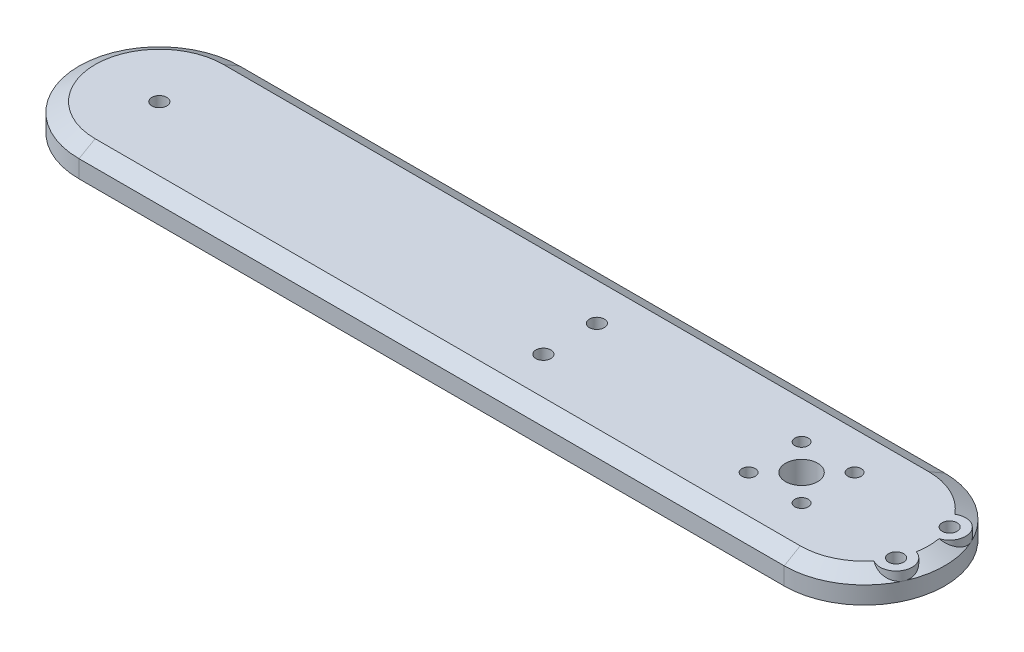
ISO-10303-21;
HEADER;
FILE_DESCRIPTION(('STEP AP214'),'2;1');
FILE_NAME('part.step','',(''),(''),'','','');
FILE_SCHEMA(('AUTOMOTIVE_DESIGN { 1 0 10303 214 1 1 1 1 }'));
ENDSEC;
DATA;
#1=APPLICATION_CONTEXT('core data for automotive mechanical design processes');
#2=APPLICATION_PROTOCOL_DEFINITION('international standard','automotive_design',2000,#1);
#3=PRODUCT_CONTEXT('',#1,'mechanical');
#4=PRODUCT('Part','Part','',(#3));
#5=PRODUCT_RELATED_PRODUCT_CATEGORY('part','',(#4));
#6=PRODUCT_DEFINITION_FORMATION('','',#4);
#7=PRODUCT_DEFINITION_CONTEXT('part definition',#1,'design');
#8=PRODUCT_DEFINITION('design','',#6,#7);
#9=PRODUCT_DEFINITION_SHAPE('','',#8);
#10=(LENGTH_UNIT() NAMED_UNIT(*) SI_UNIT(.MILLI.,.METRE.));
#11=(NAMED_UNIT(*) PLANE_ANGLE_UNIT() SI_UNIT($,.RADIAN.));
#12=(NAMED_UNIT(*) SI_UNIT($,.STERADIAN.) SOLID_ANGLE_UNIT());
#13=UNCERTAINTY_MEASURE_WITH_UNIT(LENGTH_MEASURE(1.E-05),#10,'distance_accuracy_value','');
#14=(GEOMETRIC_REPRESENTATION_CONTEXT(3) GLOBAL_UNCERTAINTY_ASSIGNED_CONTEXT((#13)) GLOBAL_UNIT_ASSIGNED_CONTEXT((#10,
#11,#12)) REPRESENTATION_CONTEXT('',''));
#15=CARTESIAN_POINT('',(0.,0.,0.));
#16=DIRECTION('',(0.,0.,1.));
#17=DIRECTION('',(1.,0.,0.));
#18=AXIS2_PLACEMENT_3D('',#15,#16,#17);
#19=CARTESIAN_POINT('',(131.75,5.,0.));
#20=DIRECTION('',(0.,-1.,0.));
#21=DIRECTION('',(0.,0.,-1.));
#22=AXIS2_PLACEMENT_3D('',#19,#20,#21);
#23=CONICAL_SURFACE('',#22,12.,1.0471975511966);
#24=CARTESIAN_POINT('',(131.75,5.,0.));
#25=DIRECTION('',(0.,1.,0.));
#26=DIRECTION('',(0.,0.,1.));
#27=AXIS2_PLACEMENT_3D('',#24,#25,#26);
#28=CIRCLE('',#27,12.);
#29=CARTESIAN_POINT('',(141.077618933992,5.,-7.54953806681159));
#30=VERTEX_POINT('',#29);
#31=CARTESIAN_POINT('',(131.75,5.,-12.));
#32=VERTEX_POINT('',#31);
#33=EDGE_CURVE('E144',#30,#32,#28,.T.);
#34=ORIENTED_EDGE('',*,*,#33,.F.);
#35=CARTESIAN_POINT('',(141.077322224237,5.0002,-7.54935403868238));
#36=CARTESIAN_POINT('',(141.156557252533,4.94678817044797,-7.59849532245087));
#37=CARTESIAN_POINT('',(141.238157752973,4.89363214228214,-7.64400414252746));
#38=CARTESIAN_POINT('',(141.405675913293,4.78807578622649,-7.72739358204015));
#39=CARTESIAN_POINT('',(141.491595007884,4.73567571701977,-7.76527164519904));
#40=CARTESIAN_POINT('',(141.755674700648,4.57970582150423,-7.86707972239534));
#41=CARTESIAN_POINT('',(141.939658060023,4.47770274482218,-7.9188722322073));
#42=CARTESIAN_POINT('',(142.318130790524,4.28039509828638,-7.98681766693718));
#43=CARTESIAN_POINT('',(142.512644761588,4.18510752549572,-8.00288309639194));
#44=CARTESIAN_POINT('',(142.905273479851,4.00426126042279,-7.99627527436065));
#45=CARTESIAN_POINT('',(143.103381423363,3.91868603955574,-7.97366892195534));
#46=CARTESIAN_POINT('',(143.479570242659,3.76653113962029,-7.89137434460179));
#47=CARTESIAN_POINT('',(143.657943074556,3.69896232923984,-7.83493708454001));
#48=CARTESIAN_POINT('',(143.917769278529,3.60717328589838,-7.72464089293876));
#49=CARTESIAN_POINT('',(144.003120344002,3.57816170009228,-7.68358149180941));
#50=CARTESIAN_POINT('',(144.170380115844,3.52357315458263,-7.593048925895));
#51=CARTESIAN_POINT('',(144.252289255344,3.49799576182667,-7.54357682373976));
#52=CARTESIAN_POINT('',(144.473365142052,3.43219915627915,-7.39498703090635));
#53=CARTESIAN_POINT('',(144.607925303175,3.39591763412093,-7.28702479306738));
#54=CARTESIAN_POINT('',(144.857786247804,3.33634694159049,-7.04791607168051));
#55=CARTESIAN_POINT('',(144.973101256229,3.31304814506793,-6.91678686074889));
#56=CARTESIAN_POINT('',(145.17061181912,3.28175697218575,-6.64792576225177));
#57=CARTESIAN_POINT('',(145.254843331859,3.27258533345847,-6.51182432536301));
#58=CARTESIAN_POINT('',(145.400634043372,3.26604279846284,-6.22773560641844));
#59=CARTESIAN_POINT('',(145.46219944674,3.26866867015588,-6.07975159061647));
#60=CARTESIAN_POINT('',(145.558959984953,3.28529330605756,-5.78235505494448));
#61=CARTESIAN_POINT('',(145.595078374449,3.29885072054545,-5.63321644011285));
#62=CARTESIAN_POINT('',(145.64412187416,3.33635060085029,-5.33247956634609));
#63=CARTESIAN_POINT('',(145.657047018265,3.36029305149308,-5.18088131100518));
#64=CARTESIAN_POINT('',(145.660100556809,3.41834505023927,-4.87679354111265));
#65=CARTESIAN_POINT('',(145.649840452357,3.45261939971543,-4.72433217892598));
#66=CARTESIAN_POINT('',(145.606972106302,3.53023187094797,-4.42498204919223));
#67=CARTESIAN_POINT('',(145.574357809823,3.57357244618014,-4.27809480283431));
#68=CARTESIAN_POINT('',(145.485912140682,3.67126155153085,-3.98414475732932));
#69=CARTESIAN_POINT('',(145.428740320811,3.72613365451266,-3.83766084394096));
#70=CARTESIAN_POINT('',(145.293933076532,3.84359357328929,-3.55786580455139));
#71=CARTESIAN_POINT('',(145.216294424116,3.9061826053613,-3.4245567610423));
#72=CARTESIAN_POINT('',(145.03531961341,4.04396825769636,-3.16165162296553));
#73=CARTESIAN_POINT('',(144.930256154494,4.11979678183466,-3.03357664651882));
#74=CARTESIAN_POINT('',(144.702831974037,4.27756085315734,-2.79808492927117));
#75=CARTESIAN_POINT('',(144.580452359524,4.35950302391616,-2.69069105904553));
#76=CARTESIAN_POINT('',(144.314666021577,4.53273442564728,-2.49265184098019));
#77=CARTESIAN_POINT('',(144.170458773441,4.62429020833901,-2.40330840728901));
#78=CARTESIAN_POINT('',(143.946044711935,4.76388810854373,-2.2889431581038));
#79=CARTESIAN_POINT('',(143.869946077227,4.81076421782348,-2.25411406625342));
#80=CARTESIAN_POINT('',(143.71544404268,4.90509300797885,-2.19103843568445));
#81=CARTESIAN_POINT('',(143.637041267394,4.95254553060478,-2.16279013139787));
#82=CARTESIAN_POINT('',(143.557677692172,5.0002,-2.1378572903497));
#83=B_SPLINE_CURVE_WITH_KNOTS('',3,(#35,#36,#37,#38,#39,#40,#41,#42,#43,#44,#45,#46,#47,#48,#49,
#50,#51,#52,#53,#54,#55,#56,#57,#58,#59,#60,#61,#62,#63,#64,#65,#66,#67,#68,#69,#70,#71,#72,#73,
#74,#75,#76,#77,#78,#79,#80,#81,#82),.UNSPECIFIED.,.F.,.F.,(4,2,2,2,2,2,2,2,2,2,2,2,2,2,2,2,2,2,
2,2,2,2,2,4),(0.,0.322173911690686,0.644455571713664,1.29102840714377,1.93918296091373,
2.58621739284114,3.17927178079538,3.47602612178941,3.77274300678716,4.29849498135217,
4.82385661224603,5.30238850109786,5.78078929964634,6.24078815170038,6.70078633162677,
7.16854941823068,7.63643925366799,8.1339829991462,8.63160526375324,9.17590331670913,
9.72079987775979,10.2967240672052,10.584280375072,10.8717594450089),.UNSPECIFIED.);
#84=CARTESIAN_POINT('',(145.385890143295,3.26794919243115,-6.25));
#85=VERTEX_POINT('',#84);
#86=EDGE_CURVE('E11',#30,#85,#83,.T.);
#87=ORIENTED_EDGE('',*,*,#86,.T.);
#88=CARTESIAN_POINT('',(131.75,3.26794919243113,0.));
#89=DIRECTION('',(0.,1.,0.));
#90=DIRECTION('',(0.,0.,1.));
#91=AXIS2_PLACEMENT_3D('',#88,#89,#90);
#92=CIRCLE('',#91,15.);
#93=CARTESIAN_POINT('',(131.75,3.26794919243113,-15.));
#94=VERTEX_POINT('',#93);
#95=EDGE_CURVE('E153',#94,#85,#92,.F.);
#96=ORIENTED_EDGE('',*,*,#95,.F.);
#97=DIRECTION('',(0.,0.499999999999995,0.866025403784441));
#98=VECTOR('',#97,1.);
#99=CARTESIAN_POINT('',(131.75,3.26794919243113,-15.));
#100=LINE('',#99,#98);
#101=EDGE_CURVE('E166',#94,#32,#100,.T.);
#102=ORIENTED_EDGE('',*,*,#101,.T.);
#103=EDGE_LOOP('',(#34,#87,#96,#102));
#104=FACE_BOUND('',#103,.T.);
#105=ADVANCED_FACE('F47',(#104),#23,.T.);
#106=CARTESIAN_POINT('',(145.385890143295,3.26794919243115,6.25));
#107=VERTEX_POINT('',#106);
#108=EDGE_CURVE('E136',#85,#107,#92,.F.);
#109=ORIENTED_EDGE('',*,*,#108,.F.);
#110=CARTESIAN_POINT('',(143.558010788115,5.,-2.13796193318843));
#111=VERTEX_POINT('',#110);
#112=EDGE_CURVE('E52',#85,#111,#83,.T.);
#113=ORIENTED_EDGE('',*,*,#112,.T.);
#114=CARTESIAN_POINT('',(143.558010788115,5.,2.13796193318842));
#115=VERTEX_POINT('',#114);
#116=EDGE_CURVE('E135',#115,#111,#28,.T.);
#117=ORIENTED_EDGE('',*,*,#116,.F.);
#118=CARTESIAN_POINT('',(141.077322224237,5.0002,7.54935403868238));
#119=CARTESIAN_POINT('',(141.156557252533,4.94678817044797,7.59849532245087));
#120=CARTESIAN_POINT('',(141.238157752973,4.89363214228214,7.64400414252746));
#121=CARTESIAN_POINT('',(141.405675913293,4.78807578622649,7.72739358204015));
#122=CARTESIAN_POINT('',(141.491595007884,4.73567571701977,7.76527164519904));
#123=CARTESIAN_POINT('',(141.755674700648,4.57970582150423,7.86707972239534));
#124=CARTESIAN_POINT('',(141.939658060023,4.47770274482218,7.9188722322073));
#125=CARTESIAN_POINT('',(142.318130790524,4.28039509828638,7.98681766693718));
#126=CARTESIAN_POINT('',(142.512644761588,4.18510752549572,8.00288309639194));
#127=CARTESIAN_POINT('',(142.905273479851,4.00426126042279,7.99627527436065));
#128=CARTESIAN_POINT('',(143.103381423363,3.91868603955574,7.97366892195534));
#129=CARTESIAN_POINT('',(143.479570242659,3.76653113962029,7.89137434460179));
#130=CARTESIAN_POINT('',(143.657943074556,3.69896232923984,7.83493708454001));
#131=CARTESIAN_POINT('',(143.917769278529,3.60717328589838,7.72464089293876));
#132=CARTESIAN_POINT('',(144.003120344002,3.57816170009228,7.68358149180941));
#133=CARTESIAN_POINT('',(144.170380115844,3.52357315458263,7.593048925895));
#134=CARTESIAN_POINT('',(144.252289255344,3.49799576182667,7.54357682373976));
#135=CARTESIAN_POINT('',(144.473365142052,3.43219915627915,7.39498703090635));
#136=CARTESIAN_POINT('',(144.607925303175,3.39591763412093,7.28702479306738));
#137=CARTESIAN_POINT('',(144.857786247804,3.33634694159049,7.04791607168051));
#138=CARTESIAN_POINT('',(144.973101256229,3.31304814506793,6.91678686074889));
#139=CARTESIAN_POINT('',(145.17061181912,3.28175697218575,6.64792576225177));
#140=CARTESIAN_POINT('',(145.254843331859,3.27258533345847,6.51182432536301));
#141=CARTESIAN_POINT('',(145.400634043372,3.26604279846284,6.22773560641844));
#142=CARTESIAN_POINT('',(145.46219944674,3.26866867015588,6.07975159061647));
#143=CARTESIAN_POINT('',(145.558959984953,3.28529330605756,5.78235505494448));
#144=CARTESIAN_POINT('',(145.595078374449,3.29885072054545,5.63321644011285));
#145=CARTESIAN_POINT('',(145.64412187416,3.33635060085029,5.33247956634609));
#146=CARTESIAN_POINT('',(145.657047018265,3.36029305149308,5.18088131100518));
#147=CARTESIAN_POINT('',(145.660100556809,3.41834505023927,4.87679354111265));
#148=CARTESIAN_POINT('',(145.649840452357,3.45261939971543,4.72433217892598));
#149=CARTESIAN_POINT('',(145.606972106302,3.53023187094797,4.42498204919223));
#150=CARTESIAN_POINT('',(145.574357809823,3.57357244618014,4.27809480283431));
#151=CARTESIAN_POINT('',(145.485912140682,3.67126155153085,3.98414475732932));
#152=CARTESIAN_POINT('',(145.428740320811,3.72613365451266,3.83766084394096));
#153=CARTESIAN_POINT('',(145.293933076532,3.84359357328929,3.55786580455139));
#154=CARTESIAN_POINT('',(145.216294424116,3.9061826053613,3.4245567610423));
#155=CARTESIAN_POINT('',(145.03531961341,4.04396825769636,3.16165162296553));
#156=CARTESIAN_POINT('',(144.930256154494,4.11979678183466,3.03357664651882));
#157=CARTESIAN_POINT('',(144.702831974037,4.27756085315734,2.79808492927117));
#158=CARTESIAN_POINT('',(144.580452359524,4.35950302391616,2.69069105904553));
#159=CARTESIAN_POINT('',(144.314666021577,4.53273442564728,2.49265184098019));
#160=CARTESIAN_POINT('',(144.170458773441,4.62429020833901,2.40330840728901));
#161=CARTESIAN_POINT('',(143.946044711935,4.76388810854373,2.2889431581038));
#162=CARTESIAN_POINT('',(143.869946077227,4.81076421782348,2.25411406625342));
#163=CARTESIAN_POINT('',(143.71544404268,4.90509300797885,2.19103843568445));
#164=CARTESIAN_POINT('',(143.637041267394,4.95254553060478,2.16279013139787));
#165=CARTESIAN_POINT('',(143.557677692172,5.0002,2.1378572903497));
#166=B_SPLINE_CURVE_WITH_KNOTS('',3,(#118,#119,#120,#121,#122,#123,#124,#125,#126,#127,#128,
#129,#130,#131,#132,#133,#134,#135,#136,#137,#138,#139,#140,#141,#142,#143,#144,#145,#146,#147,
#148,#149,#150,#151,#152,#153,#154,#155,#156,#157,#158,#159,#160,#161,#162,#163,#164,#165),
.UNSPECIFIED.,.F.,.F.,(4,2,2,2,2,2,2,2,2,2,2,2,2,2,2,2,2,2,2,2,2,2,2,4),(0.,0.322173911690686,
0.644455571713664,1.29102840714377,1.93918296091373,2.58621739284114,3.17927178079538,
3.47602612178941,3.77274300678716,4.29849498135217,4.82385661224603,5.30238850109786,
5.78078929964634,6.24078815170038,6.70078633162677,7.16854941823068,7.63643925366799,
8.1339829991462,8.63160526375324,9.17590331670913,9.72079987775979,10.2967240672052,
10.584280375072,10.8717594450089),.UNSPECIFIED.);
#167=EDGE_CURVE('E165',#107,#115,#166,.T.);
#168=ORIENTED_EDGE('',*,*,#167,.F.);
#169=EDGE_LOOP('',(#109,#113,#117,#168));
#170=FACE_BOUND('',#169,.T.);
#171=ADVANCED_FACE('F133',(#170),#23,.T.);
#172=CARTESIAN_POINT('',(141.077618933992,5.,7.54953806681159));
#173=VERTEX_POINT('',#172);
#174=EDGE_CURVE('E139',#173,#107,#166,.T.);
#175=ORIENTED_EDGE('',*,*,#174,.F.);
#176=CARTESIAN_POINT('',(131.75,5.,12.));
#177=VERTEX_POINT('',#176);
#178=EDGE_CURVE('E143',#177,#173,#28,.T.);
#179=ORIENTED_EDGE('',*,*,#178,.F.);
#180=DIRECTION('',(0.,-0.499999999999995,0.866025403784441));
#181=VECTOR('',#180,1.);
#182=CARTESIAN_POINT('',(131.75,5.,12.));
#183=LINE('',#182,#181);
#184=CARTESIAN_POINT('',(131.75,3.26794919243113,15.));
#185=VERTEX_POINT('',#184);
#186=EDGE_CURVE('E170',#177,#185,#183,.T.);
#187=ORIENTED_EDGE('',*,*,#186,.T.);
#188=EDGE_CURVE('E148',#107,#185,#92,.F.);
#189=ORIENTED_EDGE('',*,*,#188,.F.);
#190=EDGE_LOOP('',(#175,#179,#187,#189));
#191=FACE_BOUND('',#190,.T.);
#192=ADVANCED_FACE('F237',(#191),#23,.T.);
#193=CARTESIAN_POINT('',(0.,5.,0.));
#194=DIRECTION('',(0.,1.,0.));
#195=DIRECTION('',(0.,0.,1.));
#196=AXIS2_PLACEMENT_3D('',#193,#194,#195);
#197=PLANE('',#196);
#198=CARTESIAN_POINT('',(142.658712114636,5.,-5.));
#199=DIRECTION('',(0.,-1.,0.));
#200=DIRECTION('',(0.,0.,-1.));
#201=AXIS2_PLACEMENT_3D('',#198,#199,#200);
#202=CIRCLE('',#201,1.4);
#203=CARTESIAN_POINT('',(142.658712114636,5.,-6.40000000000001));
#204=VERTEX_POINT('',#203);
#205=EDGE_CURVE('E403',#204,#204,#202,.T.);
#206=ORIENTED_EDGE('',*,*,#205,.T.);
#207=EDGE_LOOP('',(#206));
#208=FACE_BOUND('',#207,.T.);
#209=CARTESIAN_POINT('',(142.658712114636,5.,5.));
#210=DIRECTION('',(0.,1.,0.));
#211=DIRECTION('',(0.,0.,1.));
#212=AXIS2_PLACEMENT_3D('',#209,#210,#211);
#213=CIRCLE('',#212,1.4);
#214=CARTESIAN_POINT('',(142.658712114636,5.,6.40000000000001));
#215=VERTEX_POINT('',#214);
#216=EDGE_CURVE('E127',#215,#215,#213,.T.);
#217=ORIENTED_EDGE('',*,*,#216,.F.);
#218=EDGE_LOOP('',(#217));
#219=FACE_BOUND('',#218,.T.);
#220=ORIENTED_EDGE('',*,*,#116,.T.);
#221=CARTESIAN_POINT('',(142.658712114636,5.,-5.));
#222=DIRECTION('',(0.,-1.,0.));
#223=DIRECTION('',(0.,0.,-1.));
#224=AXIS2_PLACEMENT_3D('',#221,#222,#223);
#225=CIRCLE('',#224,2.99999999999999);
#226=EDGE_CURVE('E70',#30,#111,#225,.T.);
#227=ORIENTED_EDGE('',*,*,#226,.F.);
#228=ORIENTED_EDGE('',*,*,#33,.T.);
#229=DIRECTION('',(-1.,0.,0.));
#230=VECTOR('',#229,1.);
#231=CARTESIAN_POINT('',(0.,5.,-12.));
#232=LINE('',#231,#230);
#233=CARTESIAN_POINT('',(0.,5.,-12.));
#234=VERTEX_POINT('',#233);
#235=EDGE_CURVE('E294',#32,#234,#232,.T.);
#236=ORIENTED_EDGE('',*,*,#235,.T.);
#237=CARTESIAN_POINT('',(0.,5.,0.));
#238=DIRECTION('',(0.,1.,0.));
#239=DIRECTION('',(0.,0.,1.));
#240=AXIS2_PLACEMENT_3D('',#237,#238,#239);
#241=CIRCLE('',#240,12.);
#242=CARTESIAN_POINT('',(0.,5.,12.));
#243=VERTEX_POINT('',#242);
#244=EDGE_CURVE('E276',#234,#243,#241,.T.);
#245=ORIENTED_EDGE('',*,*,#244,.T.);
#246=DIRECTION('',(1.,0.,0.));
#247=VECTOR('',#246,1.);
#248=CARTESIAN_POINT('',(131.75,5.,12.));
#249=LINE('',#248,#247);
#250=EDGE_CURVE('E149',#243,#177,#249,.T.);
#251=ORIENTED_EDGE('',*,*,#250,.T.);
#252=ORIENTED_EDGE('',*,*,#178,.T.);
#253=CARTESIAN_POINT('',(142.658712114636,5.,5.));
#254=DIRECTION('',(0.,1.,0.));
#255=DIRECTION('',(0.,0.,1.));
#256=AXIS2_PLACEMENT_3D('',#253,#254,#255);
#257=CIRCLE('',#256,2.99999999999999);
#258=EDGE_CURVE('E76',#173,#115,#257,.T.);
#259=ORIENTED_EDGE('',*,*,#258,.T.);
#260=EDGE_LOOP('',(#220,#227,#228,#236,#245,#251,#252,#259));
#261=FACE_BOUND('',#260,.T.);
#262=CARTESIAN_POINT('',(76.75,5.,-4.99999999999999));
#263=DIRECTION('',(0.,1.,0.));
#264=DIRECTION('',(0.,0.,1.));
#265=AXIS2_PLACEMENT_3D('',#262,#263,#264);
#266=CIRCLE('',#265,1.4);
#267=CARTESIAN_POINT('',(76.75,5.,-3.59999999999999));
#268=VERTEX_POINT('',#267);
#269=EDGE_CURVE('E387',#268,#268,#266,.T.);
#270=ORIENTED_EDGE('',*,*,#269,.F.);
#271=EDGE_LOOP('',(#270));
#272=FACE_BOUND('',#271,.T.);
#273=CARTESIAN_POINT('',(76.75,5.,5.00000000000001));
#274=DIRECTION('',(0.,1.,0.));
#275=DIRECTION('',(0.,0.,-1.));
#276=AXIS2_PLACEMENT_3D('',#273,#274,#275);
#277=CIRCLE('',#276,1.4);
#278=CARTESIAN_POINT('',(76.75,5.,3.60000000000001));
#279=VERTEX_POINT('',#278);
#280=EDGE_CURVE('E383',#279,#279,#277,.T.);
#281=ORIENTED_EDGE('',*,*,#280,.F.);
#282=EDGE_LOOP('',(#281));
#283=FACE_BOUND('',#282,.T.);
#284=CARTESIAN_POINT('',(124.949747468306,5.,4.9497474683058));
#285=DIRECTION('',(0.,1.,0.));
#286=DIRECTION('',(0.,0.,1.));
#287=AXIS2_PLACEMENT_3D('',#284,#285,#286);
#288=CIRCLE('',#287,1.25000000000001);
#289=CARTESIAN_POINT('',(124.949747468306,5.,6.19974746830581));
#290=VERTEX_POINT('',#289);
#291=EDGE_CURVE('E361',#290,#290,#288,.T.);
#292=ORIENTED_EDGE('',*,*,#291,.F.);
#293=EDGE_LOOP('',(#292));
#294=FACE_BOUND('',#293,.T.);
#295=CARTESIAN_POINT('',(124.949747468306,5.,-4.94974746830584));
#296=DIRECTION('',(0.,1.,0.));
#297=DIRECTION('',(0.,0.,1.));
#298=AXIS2_PLACEMENT_3D('',#295,#296,#297);
#299=CIRCLE('',#298,1.25);
#300=CARTESIAN_POINT('',(124.949747468306,5.,-3.69974746830585));
#301=VERTEX_POINT('',#300);
#302=EDGE_CURVE('E345',#301,#301,#299,.T.);
#303=ORIENTED_EDGE('',*,*,#302,.F.);
#304=EDGE_LOOP('',(#303));
#305=FACE_BOUND('',#304,.T.);
#306=CARTESIAN_POINT('',(120.,5.,0.));
#307=DIRECTION('',(0.,1.,0.));
#308=DIRECTION('',(0.,0.,1.));
#309=AXIS2_PLACEMENT_3D('',#306,#307,#308);
#310=CIRCLE('',#309,2.99999999999999);
#311=CARTESIAN_POINT('',(120.,5.,2.99999999999999));
#312=VERTEX_POINT('',#311);
#313=EDGE_CURVE('E331',#312,#312,#310,.T.);
#314=ORIENTED_EDGE('',*,*,#313,.F.);
#315=EDGE_LOOP('',(#314));
#316=FACE_BOUND('',#315,.T.);
#317=CARTESIAN_POINT('',(115.050252531694,5.,-4.9497474683058));
#318=DIRECTION('',(0.,1.,0.));
#319=DIRECTION('',(0.,0.,1.));
#320=AXIS2_PLACEMENT_3D('',#317,#318,#319);
#321=CIRCLE('',#320,1.25);
#322=CARTESIAN_POINT('',(115.050252531694,5.,-3.6997474683058));
#323=VERTEX_POINT('',#322);
#324=EDGE_CURVE('E339',#323,#323,#321,.T.);
#325=ORIENTED_EDGE('',*,*,#324,.F.);
#326=EDGE_LOOP('',(#325));
#327=FACE_BOUND('',#326,.T.);
#328=CARTESIAN_POINT('',(0.,5.,0.));
#329=DIRECTION('',(0.,1.,0.));
#330=DIRECTION('',(0.,0.,1.));
#331=AXIS2_PLACEMENT_3D('',#328,#329,#330);
#332=CIRCLE('',#331,1.4);
#333=CARTESIAN_POINT('',(0.,5.,1.4));
#334=VERTEX_POINT('',#333);
#335=EDGE_CURVE('E353',#334,#334,#332,.T.);
#336=ORIENTED_EDGE('',*,*,#335,.F.);
#337=EDGE_LOOP('',(#336));
#338=FACE_BOUND('',#337,.T.);
#339=CARTESIAN_POINT('',(115.050252531694,5.,4.94974746830584));
#340=DIRECTION('',(0.,1.,0.));
#341=DIRECTION('',(0.,0.,1.));
#342=AXIS2_PLACEMENT_3D('',#339,#340,#341);
#343=CIRCLE('',#342,1.25);
#344=CARTESIAN_POINT('',(115.050252531694,5.,6.19974746830584));
#345=VERTEX_POINT('',#344);
#346=EDGE_CURVE('E369',#345,#345,#343,.T.);
#347=ORIENTED_EDGE('',*,*,#346,.F.);
#348=EDGE_LOOP('',(#347));
#349=FACE_BOUND('',#348,.T.);
#350=ADVANCED_FACE('F140',(#208,#219,#261,#272,#283,#294,#305,#316,#327,#338,#349),#197,.T.);
#351=CARTESIAN_POINT('',(0.,0.,0.));
#352=DIRECTION('',(0.,1.,0.));
#353=DIRECTION('',(0.,0.,1.));
#354=AXIS2_PLACEMENT_3D('',#351,#352,#353);
#355=PLANE('',#354);
#356=CARTESIAN_POINT('',(142.658712114636,0.,-5.));
#357=DIRECTION('',(0.,-1.,0.));
#358=DIRECTION('',(0.,0.,-1.));
#359=AXIS2_PLACEMENT_3D('',#356,#357,#358);
#360=CIRCLE('',#359,1.4);
#361=CARTESIAN_POINT('',(142.658712114636,0.,-6.40000000000001));
#362=VERTEX_POINT('',#361);
#363=EDGE_CURVE('E128',#362,#362,#360,.T.);
#364=ORIENTED_EDGE('',*,*,#363,.F.);
#365=EDGE_LOOP('',(#364));
#366=FACE_BOUND('',#365,.T.);
#367=CARTESIAN_POINT('',(142.658712114636,0.,5.));
#368=DIRECTION('',(0.,1.,0.));
#369=DIRECTION('',(0.,0.,1.));
#370=AXIS2_PLACEMENT_3D('',#367,#368,#369);
#371=CIRCLE('',#370,1.4);
#372=CARTESIAN_POINT('',(142.658712114636,0.,6.40000000000001));
#373=VERTEX_POINT('',#372);
#374=EDGE_CURVE('E396',#373,#373,#371,.T.);
#375=ORIENTED_EDGE('',*,*,#374,.T.);
#376=EDGE_LOOP('',(#375));
#377=FACE_BOUND('',#376,.T.);
#378=CARTESIAN_POINT('',(76.75,0.,-4.99999999999999));
#379=DIRECTION('',(0.,1.,0.));
#380=DIRECTION('',(0.,0.,1.));
#381=AXIS2_PLACEMENT_3D('',#378,#379,#380);
#382=CIRCLE('',#381,1.4);
#383=CARTESIAN_POINT('',(76.75,0.,-3.59999999999999));
#384=VERTEX_POINT('',#383);
#385=EDGE_CURVE('E171',#384,#384,#382,.T.);
#386=ORIENTED_EDGE('',*,*,#385,.T.);
#387=EDGE_LOOP('',(#386));
#388=FACE_BOUND('',#387,.T.);
#389=CARTESIAN_POINT('',(76.75,0.,5.00000000000001));
#390=DIRECTION('',(0.,1.,0.));
#391=DIRECTION('',(0.,0.,-1.));
#392=AXIS2_PLACEMENT_3D('',#389,#390,#391);
#393=CIRCLE('',#392,1.4);
#394=CARTESIAN_POINT('',(76.75,0.,3.60000000000001));
#395=VERTEX_POINT('',#394);
#396=EDGE_CURVE('E379',#395,#395,#393,.T.);
#397=ORIENTED_EDGE('',*,*,#396,.T.);
#398=EDGE_LOOP('',(#397));
#399=FACE_BOUND('',#398,.T.);
#400=DIRECTION('',(-1.,0.,0.));
#401=VECTOR('',#400,1.);
#402=CARTESIAN_POINT('',(0.,0.,-15.));
#403=LINE('',#402,#401);
#404=CARTESIAN_POINT('',(131.75,0.,-15.));
#405=VERTEX_POINT('',#404);
#406=CARTESIAN_POINT('',(0.,0.,-15.));
#407=VERTEX_POINT('',#406);
#408=EDGE_CURVE('E318',#405,#407,#403,.T.);
#409=ORIENTED_EDGE('',*,*,#408,.F.);
#410=CARTESIAN_POINT('',(131.75,0.,0.));
#411=DIRECTION('',(0.,1.,0.));
#412=DIRECTION('',(0.,0.,1.));
#413=AXIS2_PLACEMENT_3D('',#410,#411,#412);
#414=CIRCLE('',#413,15.);
#415=CARTESIAN_POINT('',(131.75,0.,15.));
#416=VERTEX_POINT('',#415);
#417=EDGE_CURVE('E315',#416,#405,#414,.T.);
#418=ORIENTED_EDGE('',*,*,#417,.F.);
#419=DIRECTION('',(1.,0.,0.));
#420=VECTOR('',#419,1.);
#421=CARTESIAN_POINT('',(0.,0.,15.));
#422=LINE('',#421,#420);
#423=CARTESIAN_POINT('',(0.,0.,15.));
#424=VERTEX_POINT('',#423);
#425=EDGE_CURVE('E286',#424,#416,#422,.T.);
#426=ORIENTED_EDGE('',*,*,#425,.F.);
#427=CARTESIAN_POINT('',(0.,0.,0.));
#428=DIRECTION('',(0.,1.,0.));
#429=DIRECTION('',(0.,0.,1.));
#430=AXIS2_PLACEMENT_3D('',#427,#428,#429);
#431=CIRCLE('',#430,15.);
#432=EDGE_CURVE('E323',#407,#424,#431,.T.);
#433=ORIENTED_EDGE('',*,*,#432,.F.);
#434=EDGE_LOOP('',(#409,#418,#426,#433));
#435=FACE_BOUND('',#434,.T.);
#436=CARTESIAN_POINT('',(120.,0.,0.));
#437=DIRECTION('',(0.,1.,0.));
#438=DIRECTION('',(0.,0.,1.));
#439=AXIS2_PLACEMENT_3D('',#436,#437,#438);
#440=CIRCLE('',#439,2.99999999999999);
#441=CARTESIAN_POINT('',(120.,0.,2.99999999999999));
#442=VERTEX_POINT('',#441);
#443=EDGE_CURVE('E334',#442,#442,#440,.T.);
#444=ORIENTED_EDGE('',*,*,#443,.T.);
#445=EDGE_LOOP('',(#444));
#446=FACE_BOUND('',#445,.T.);
#447=CARTESIAN_POINT('',(115.050252531694,0.,-4.9497474683058));
#448=DIRECTION('',(0.,1.,0.));
#449=DIRECTION('',(0.,0.,1.));
#450=AXIS2_PLACEMENT_3D('',#447,#448,#449);
#451=CIRCLE('',#450,1.25);
#452=CARTESIAN_POINT('',(115.050252531694,0.,-3.6997474683058));
#453=VERTEX_POINT('',#452);
#454=EDGE_CURVE('E341',#453,#453,#451,.T.);
#455=ORIENTED_EDGE('',*,*,#454,.T.);
#456=EDGE_LOOP('',(#455));
#457=FACE_BOUND('',#456,.T.);
#458=CARTESIAN_POINT('',(124.949747468306,0.,-4.94974746830584));
#459=DIRECTION('',(0.,1.,0.));
#460=DIRECTION('',(0.,0.,1.));
#461=AXIS2_PLACEMENT_3D('',#458,#459,#460);
#462=CIRCLE('',#461,1.25);
#463=CARTESIAN_POINT('',(124.949747468306,0.,-3.69974746830585));
#464=VERTEX_POINT('',#463);
#465=EDGE_CURVE('E349',#464,#464,#462,.T.);
#466=ORIENTED_EDGE('',*,*,#465,.T.);
#467=EDGE_LOOP('',(#466));
#468=FACE_BOUND('',#467,.T.);
#469=CARTESIAN_POINT('',(0.,0.,0.));
#470=DIRECTION('',(0.,1.,0.));
#471=DIRECTION('',(0.,0.,1.));
#472=AXIS2_PLACEMENT_3D('',#469,#470,#471);
#473=CIRCLE('',#472,1.4);
#474=CARTESIAN_POINT('',(0.,0.,1.4));
#475=VERTEX_POINT('',#474);
#476=EDGE_CURVE('E357',#475,#475,#473,.T.);
#477=ORIENTED_EDGE('',*,*,#476,.T.);
#478=EDGE_LOOP('',(#477));
#479=FACE_BOUND('',#478,.T.);
#480=CARTESIAN_POINT('',(124.949747468306,0.,4.9497474683058));
#481=DIRECTION('',(0.,1.,0.));
#482=DIRECTION('',(0.,0.,1.));
#483=AXIS2_PLACEMENT_3D('',#480,#481,#482);
#484=CIRCLE('',#483,1.25000000000001);
#485=CARTESIAN_POINT('',(124.949747468306,0.,6.19974746830581));
#486=VERTEX_POINT('',#485);
#487=EDGE_CURVE('E365',#486,#486,#484,.T.);
#488=ORIENTED_EDGE('',*,*,#487,.T.);
#489=EDGE_LOOP('',(#488));
#490=FACE_BOUND('',#489,.T.);
#491=CARTESIAN_POINT('',(115.050252531694,0.,4.94974746830584));
#492=DIRECTION('',(0.,1.,0.));
#493=DIRECTION('',(0.,0.,1.));
#494=AXIS2_PLACEMENT_3D('',#491,#492,#493);
#495=CIRCLE('',#494,1.25);
#496=CARTESIAN_POINT('',(115.050252531694,0.,6.19974746830584));
#497=VERTEX_POINT('',#496);
#498=EDGE_CURVE('E182',#497,#497,#495,.T.);
#499=ORIENTED_EDGE('',*,*,#498,.T.);
#500=EDGE_LOOP('',(#499));
#501=FACE_BOUND('',#500,.T.);
#502=ADVANCED_FACE('F236',(#366,#377,#388,#399,#435,#446,#457,#468,#479,#490,#501),#355,.F.);
#503=CARTESIAN_POINT('',(0.,5.,0.));
#504=DIRECTION('',(0.,-1.,0.));
#505=DIRECTION('',(0.,0.,-1.));
#506=AXIS2_PLACEMENT_3D('',#503,#504,#505);
#507=CYLINDRICAL_SURFACE('',#506,15.);
#508=DIRECTION('',(0.,-1.,0.));
#509=VECTOR('',#508,1.);
#510=CARTESIAN_POINT('',(0.,5.,15.));
#511=LINE('',#510,#509);
#512=CARTESIAN_POINT('',(0.,3.26794919243113,15.));
#513=VERTEX_POINT('',#512);
#514=EDGE_CURVE('E289',#513,#424,#511,.T.);
#515=ORIENTED_EDGE('',*,*,#514,.F.);
#516=CARTESIAN_POINT('',(0.,3.26794919243113,0.));
#517=DIRECTION('',(0.,1.,0.));
#518=DIRECTION('',(0.,0.,1.));
#519=AXIS2_PLACEMENT_3D('',#516,#517,#518);
#520=CIRCLE('',#519,15.);
#521=CARTESIAN_POINT('',(0.,3.26794919243113,-15.));
#522=VERTEX_POINT('',#521);
#523=EDGE_CURVE('E159',#513,#522,#520,.F.);
#524=ORIENTED_EDGE('',*,*,#523,.T.);
#525=DIRECTION('',(0.,-1.,0.));
#526=VECTOR('',#525,1.);
#527=CARTESIAN_POINT('',(0.,5.,-15.));
#528=LINE('',#527,#526);
#529=EDGE_CURVE('E297',#522,#407,#528,.T.);
#530=ORIENTED_EDGE('',*,*,#529,.T.);
#531=ORIENTED_EDGE('',*,*,#432,.T.);
#532=EDGE_LOOP('',(#515,#524,#530,#531));
#533=FACE_BOUND('',#532,.T.);
#534=ADVANCED_FACE('F241',(#533),#507,.T.);
#535=CARTESIAN_POINT('',(0.,5.,15.));
#536=DIRECTION('',(0.,0.,-1.));
#537=DIRECTION('',(-1.,0.,0.));
#538=AXIS2_PLACEMENT_3D('',#535,#536,#537);
#539=PLANE('',#538);
#540=DIRECTION('',(0.,-1.,0.));
#541=VECTOR('',#540,1.);
#542=CARTESIAN_POINT('',(131.75,5.,15.));
#543=LINE('',#542,#541);
#544=EDGE_CURVE('E284',#185,#416,#543,.T.);
#545=ORIENTED_EDGE('',*,*,#544,.F.);
#546=DIRECTION('',(-1.,0.,0.));
#547=VECTOR('',#546,1.);
#548=CARTESIAN_POINT('',(0.,3.26794919243113,15.));
#549=LINE('',#548,#547);
#550=EDGE_CURVE('E156',#185,#513,#549,.T.);
#551=ORIENTED_EDGE('',*,*,#550,.T.);
#552=ORIENTED_EDGE('',*,*,#514,.T.);
#553=ORIENTED_EDGE('',*,*,#425,.T.);
#554=EDGE_LOOP('',(#545,#551,#552,#553));
#555=FACE_BOUND('',#554,.T.);
#556=ADVANCED_FACE('F249',(#555),#539,.F.);
#557=CARTESIAN_POINT('',(131.75,5.,0.));
#558=DIRECTION('',(0.,-1.,0.));
#559=DIRECTION('',(0.,0.,-1.));
#560=AXIS2_PLACEMENT_3D('',#557,#558,#559);
#561=CYLINDRICAL_SURFACE('',#560,15.);
#562=ORIENTED_EDGE('',*,*,#417,.T.);
#563=DIRECTION('',(0.,-1.,0.));
#564=VECTOR('',#563,1.);
#565=CARTESIAN_POINT('',(131.75,5.,-15.));
#566=LINE('',#565,#564);
#567=EDGE_CURVE('E290',#94,#405,#566,.T.);
#568=ORIENTED_EDGE('',*,*,#567,.F.);
#569=ORIENTED_EDGE('',*,*,#95,.T.);
#570=ORIENTED_EDGE('',*,*,#108,.T.);
#571=ORIENTED_EDGE('',*,*,#188,.T.);
#572=ORIENTED_EDGE('',*,*,#544,.T.);
#573=EDGE_LOOP('',(#562,#568,#569,#570,#571,#572));
#574=FACE_BOUND('',#573,.T.);
#575=ADVANCED_FACE('F245',(#574),#561,.T.);
#576=CARTESIAN_POINT('',(0.,5.,-15.));
#577=DIRECTION('',(0.,0.,1.));
#578=DIRECTION('',(1.,0.,0.));
#579=AXIS2_PLACEMENT_3D('',#576,#577,#578);
#580=PLANE('',#579);
#581=ORIENTED_EDGE('',*,*,#529,.F.);
#582=DIRECTION('',(1.,0.,0.));
#583=VECTOR('',#582,1.);
#584=CARTESIAN_POINT('',(131.75,3.26794919243113,-15.));
#585=LINE('',#584,#583);
#586=EDGE_CURVE('E162',#522,#94,#585,.T.);
#587=ORIENTED_EDGE('',*,*,#586,.T.);
#588=ORIENTED_EDGE('',*,*,#567,.T.);
#589=ORIENTED_EDGE('',*,*,#408,.T.);
#590=EDGE_LOOP('',(#581,#587,#588,#589));
#591=FACE_BOUND('',#590,.T.);
#592=ADVANCED_FACE('F232',(#591),#580,.F.);
#593=CARTESIAN_POINT('',(120.,5.,0.));
#594=DIRECTION('',(0.,-1.,0.));
#595=DIRECTION('',(0.,0.,-1.));
#596=AXIS2_PLACEMENT_3D('',#593,#594,#595);
#597=CYLINDRICAL_SURFACE('',#596,2.99999999999999);
#598=ORIENTED_EDGE('',*,*,#313,.T.);
#599=EDGE_LOOP('',(#598));
#600=FACE_BOUND('',#599,.T.);
#601=ORIENTED_EDGE('',*,*,#443,.F.);
#602=EDGE_LOOP('',(#601));
#603=FACE_BOUND('',#602,.T.);
#604=ADVANCED_FACE('F228',(#600,#603),#597,.F.);
#605=CARTESIAN_POINT('',(115.050252531694,5.,-4.9497474683058));
#606=DIRECTION('',(0.,-1.,0.));
#607=DIRECTION('',(0.,0.,-1.));
#608=AXIS2_PLACEMENT_3D('',#605,#606,#607);
#609=CYLINDRICAL_SURFACE('',#608,1.25);
#610=ORIENTED_EDGE('',*,*,#324,.T.);
#611=EDGE_LOOP('',(#610));
#612=FACE_BOUND('',#611,.T.);
#613=ORIENTED_EDGE('',*,*,#454,.F.);
#614=EDGE_LOOP('',(#613));
#615=FACE_BOUND('',#614,.T.);
#616=ADVANCED_FACE('F224',(#612,#615),#609,.F.);
#617=CARTESIAN_POINT('',(124.949747468306,5.,-4.94974746830584));
#618=DIRECTION('',(0.,-1.,0.));
#619=DIRECTION('',(0.,0.,-1.));
#620=AXIS2_PLACEMENT_3D('',#617,#618,#619);
#621=CYLINDRICAL_SURFACE('',#620,1.25);
#622=ORIENTED_EDGE('',*,*,#302,.T.);
#623=EDGE_LOOP('',(#622));
#624=FACE_BOUND('',#623,.T.);
#625=ORIENTED_EDGE('',*,*,#465,.F.);
#626=EDGE_LOOP('',(#625));
#627=FACE_BOUND('',#626,.T.);
#628=ADVANCED_FACE('F220',(#624,#627),#621,.F.);
#629=CARTESIAN_POINT('',(0.,5.,0.));
#630=DIRECTION('',(0.,-1.,0.));
#631=DIRECTION('',(0.,0.,-1.));
#632=AXIS2_PLACEMENT_3D('',#629,#630,#631);
#633=CYLINDRICAL_SURFACE('',#632,1.4);
#634=ORIENTED_EDGE('',*,*,#335,.T.);
#635=EDGE_LOOP('',(#634));
#636=FACE_BOUND('',#635,.T.);
#637=ORIENTED_EDGE('',*,*,#476,.F.);
#638=EDGE_LOOP('',(#637));
#639=FACE_BOUND('',#638,.T.);
#640=ADVANCED_FACE('F216',(#636,#639),#633,.F.);
#641=CARTESIAN_POINT('',(124.949747468306,5.,4.9497474683058));
#642=DIRECTION('',(0.,-1.,0.));
#643=DIRECTION('',(0.,0.,-1.));
#644=AXIS2_PLACEMENT_3D('',#641,#642,#643);
#645=CYLINDRICAL_SURFACE('',#644,1.25000000000001);
#646=ORIENTED_EDGE('',*,*,#291,.T.);
#647=EDGE_LOOP('',(#646));
#648=FACE_BOUND('',#647,.T.);
#649=ORIENTED_EDGE('',*,*,#487,.F.);
#650=EDGE_LOOP('',(#649));
#651=FACE_BOUND('',#650,.T.);
#652=ADVANCED_FACE('F212',(#648,#651),#645,.F.);
#653=CARTESIAN_POINT('',(115.050252531694,5.,4.94974746830584));
#654=DIRECTION('',(0.,-1.,0.));
#655=DIRECTION('',(0.,0.,-1.));
#656=AXIS2_PLACEMENT_3D('',#653,#654,#655);
#657=CYLINDRICAL_SURFACE('',#656,1.25);
#658=ORIENTED_EDGE('',*,*,#346,.T.);
#659=EDGE_LOOP('',(#658));
#660=FACE_BOUND('',#659,.T.);
#661=ORIENTED_EDGE('',*,*,#498,.F.);
#662=EDGE_LOOP('',(#661));
#663=FACE_BOUND('',#662,.T.);
#664=ADVANCED_FACE('F209',(#660,#663),#657,.F.);
#665=CARTESIAN_POINT('',(0.,5.,0.));
#666=DIRECTION('',(0.,-1.,0.));
#667=DIRECTION('',(0.,0.,-1.));
#668=AXIS2_PLACEMENT_3D('',#665,#666,#667);
#669=CONICAL_SURFACE('',#668,12.,1.0471975511966);
#670=DIRECTION('',(0.,0.499999999999995,0.866025403784441));
#671=VECTOR('',#670,1.);
#672=CARTESIAN_POINT('',(0.,3.26794919243113,-15.));
#673=LINE('',#672,#671);
#674=EDGE_CURVE('E175',#522,#234,#673,.T.);
#675=ORIENTED_EDGE('',*,*,#674,.F.);
#676=ORIENTED_EDGE('',*,*,#523,.F.);
#677=DIRECTION('',(0.,-0.499999999999995,0.866025403784441));
#678=VECTOR('',#677,1.);
#679=CARTESIAN_POINT('',(0.,5.,12.));
#680=LINE('',#679,#678);
#681=EDGE_CURVE('E179',#243,#513,#680,.T.);
#682=ORIENTED_EDGE('',*,*,#681,.F.);
#683=ORIENTED_EDGE('',*,*,#244,.F.);
#684=EDGE_LOOP('',(#675,#676,#682,#683));
#685=FACE_BOUND('',#684,.T.);
#686=ADVANCED_FACE('F50',(#685),#669,.T.);
#687=CARTESIAN_POINT('',(0.,5.,12.));
#688=DIRECTION('',(0.,0.866025403784441,0.499999999999995));
#689=DIRECTION('',(-1.,0.,0.));
#690=AXIS2_PLACEMENT_3D('',#687,#688,#689);
#691=PLANE('',#690);
#692=ORIENTED_EDGE('',*,*,#681,.T.);
#693=ORIENTED_EDGE('',*,*,#550,.F.);
#694=ORIENTED_EDGE('',*,*,#186,.F.);
#695=ORIENTED_EDGE('',*,*,#250,.F.);
#696=EDGE_LOOP('',(#692,#693,#694,#695));
#697=FACE_BOUND('',#696,.T.);
#698=ADVANCED_FACE('F281',(#697),#691,.T.);
#699=CARTESIAN_POINT('',(0.,5.,-12.));
#700=DIRECTION('',(0.,0.866025403784441,-0.499999999999995));
#701=DIRECTION('',(1.,0.,0.));
#702=AXIS2_PLACEMENT_3D('',#699,#700,#701);
#703=PLANE('',#702);
#704=ORIENTED_EDGE('',*,*,#674,.T.);
#705=ORIENTED_EDGE('',*,*,#235,.F.);
#706=ORIENTED_EDGE('',*,*,#101,.F.);
#707=ORIENTED_EDGE('',*,*,#586,.F.);
#708=EDGE_LOOP('',(#704,#705,#706,#707));
#709=FACE_BOUND('',#708,.T.);
#710=ADVANCED_FACE('F207',(#709),#703,.T.);
#711=CARTESIAN_POINT('',(76.75,0.,5.00000000000001));
#712=DIRECTION('',(0.,1.,0.));
#713=DIRECTION('',(0.,0.,1.));
#714=AXIS2_PLACEMENT_3D('',#711,#712,#713);
#715=CYLINDRICAL_SURFACE('',#714,1.4);
#716=ORIENTED_EDGE('',*,*,#396,.F.);
#717=EDGE_LOOP('',(#716));
#718=FACE_BOUND('',#717,.T.);
#719=ORIENTED_EDGE('',*,*,#280,.T.);
#720=EDGE_LOOP('',(#719));
#721=FACE_BOUND('',#720,.T.);
#722=ADVANCED_FACE('F203',(#718,#721),#715,.F.);
#723=CARTESIAN_POINT('',(76.75,0.,-4.99999999999999));
#724=DIRECTION('',(0.,1.,0.));
#725=DIRECTION('',(0.,0.,1.));
#726=AXIS2_PLACEMENT_3D('',#723,#724,#725);
#727=CYLINDRICAL_SURFACE('',#726,1.4);
#728=ORIENTED_EDGE('',*,*,#385,.F.);
#729=EDGE_LOOP('',(#728));
#730=FACE_BOUND('',#729,.T.);
#731=ORIENTED_EDGE('',*,*,#269,.T.);
#732=EDGE_LOOP('',(#731));
#733=FACE_BOUND('',#732,.T.);
#734=ADVANCED_FACE('F199',(#730,#733),#727,.F.);
#735=CARTESIAN_POINT('',(142.658712114636,0.,5.));
#736=DIRECTION('',(0.,1.,0.));
#737=DIRECTION('',(0.,0.,1.));
#738=AXIS2_PLACEMENT_3D('',#735,#736,#737);
#739=CYLINDRICAL_SURFACE('',#738,2.99999999999999);
#740=ORIENTED_EDGE('',*,*,#258,.F.);
#741=ORIENTED_EDGE('',*,*,#174,.T.);
#742=ORIENTED_EDGE('',*,*,#167,.T.);
#743=EDGE_LOOP('',(#740,#741,#742));
#744=FACE_BOUND('',#743,.T.);
#745=ADVANCED_FACE('F193',(#744),#739,.T.);
#746=CARTESIAN_POINT('',(142.658712114636,0.,5.));
#747=DIRECTION('',(0.,1.,0.));
#748=DIRECTION('',(0.,0.,1.));
#749=AXIS2_PLACEMENT_3D('',#746,#747,#748);
#750=CYLINDRICAL_SURFACE('',#749,1.4);
#751=ORIENTED_EDGE('',*,*,#374,.F.);
#752=EDGE_LOOP('',(#751));
#753=FACE_BOUND('',#752,.T.);
#754=ORIENTED_EDGE('',*,*,#216,.T.);
#755=EDGE_LOOP('',(#754));
#756=FACE_BOUND('',#755,.T.);
#757=ADVANCED_FACE('F198',(#753,#756),#750,.F.);
#758=CARTESIAN_POINT('',(142.658712114636,0.,-5.));
#759=DIRECTION('',(0.,1.,0.));
#760=DIRECTION('',(0.,0.,1.));
#761=AXIS2_PLACEMENT_3D('',#758,#759,#760);
#762=CYLINDRICAL_SURFACE('',#761,2.99999999999999);
#763=ORIENTED_EDGE('',*,*,#86,.F.);
#764=ORIENTED_EDGE('',*,*,#226,.T.);
#765=ORIENTED_EDGE('',*,*,#112,.F.);
#766=EDGE_LOOP('',(#763,#764,#765));
#767=FACE_BOUND('',#766,.T.);
#768=ADVANCED_FACE('F124',(#767),#762,.T.);
#769=CARTESIAN_POINT('',(142.658712114636,0.,-5.));
#770=DIRECTION('',(0.,1.,0.));
#771=DIRECTION('',(0.,0.,1.));
#772=AXIS2_PLACEMENT_3D('',#769,#770,#771);
#773=CYLINDRICAL_SURFACE('',#772,1.4);
#774=ORIENTED_EDGE('',*,*,#363,.T.);
#775=EDGE_LOOP('',(#774));
#776=FACE_BOUND('',#775,.T.);
#777=ORIENTED_EDGE('',*,*,#205,.F.);
#778=EDGE_LOOP('',(#777));
#779=FACE_BOUND('',#778,.T.);
#780=ADVANCED_FACE('F411',(#776,#779),#773,.F.);
#781=CLOSED_SHELL('',(#105,#171,#192,#350,#502,#534,#556,#575,#592,#604,#616,#628,#640,#652,
#664,#686,#698,#710,#722,#734,#745,#757,#768,#780));
#782=MANIFOLD_SOLID_BREP('B2',#781);
#783=ADVANCED_BREP_SHAPE_REPRESENTATION('',(#18,#782),#14);
#784=SHAPE_DEFINITION_REPRESENTATION(#9,#783);
ENDSEC;
END-ISO-10303-21;
